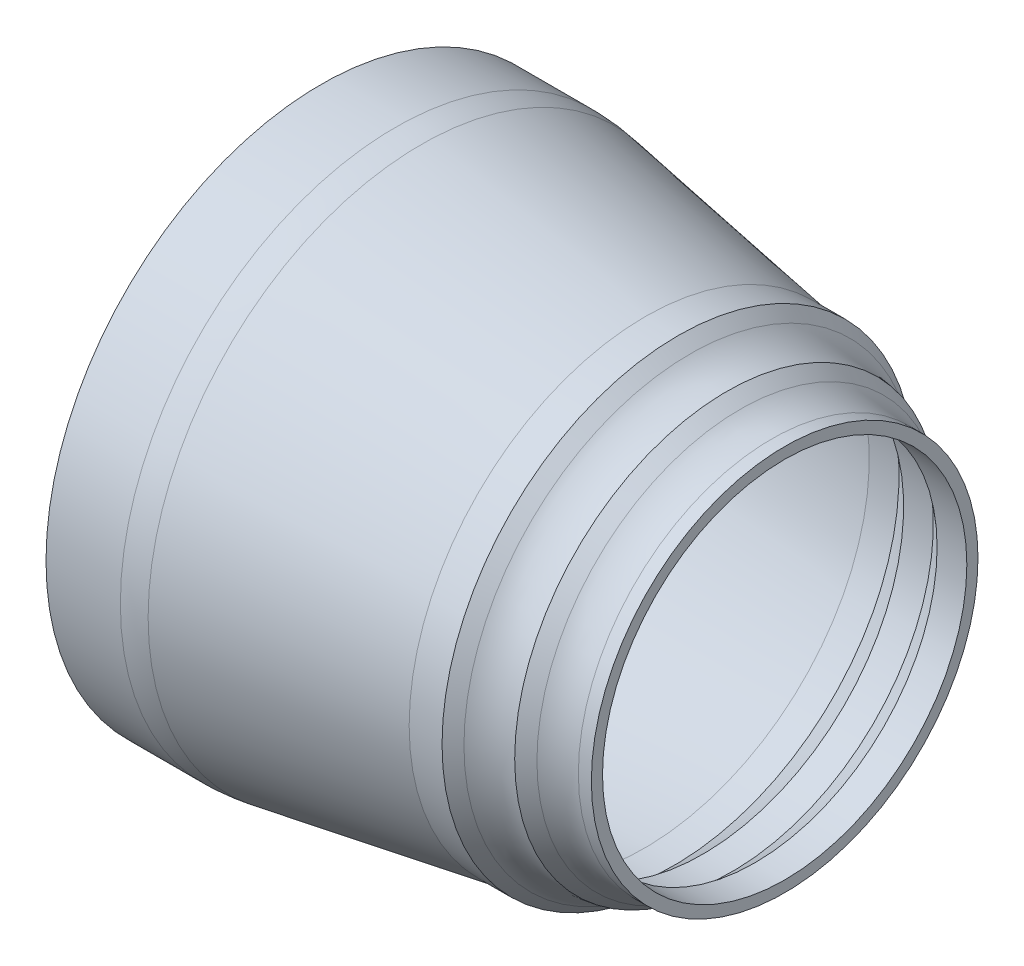
ISO-10303-21;
HEADER;
FILE_DESCRIPTION(('STEP AP214'),'2;1');
FILE_NAME('part.step','',(''),(''),'','','');
FILE_SCHEMA(('AUTOMOTIVE_DESIGN { 1 0 10303 214 1 1 1 1 }'));
ENDSEC;
DATA;
#1=APPLICATION_CONTEXT('core data for automotive mechanical design processes');
#2=APPLICATION_PROTOCOL_DEFINITION('international standard','automotive_design',2000,#1);
#3=PRODUCT_CONTEXT('',#1,'mechanical');
#4=PRODUCT('Part','Part','',(#3));
#5=PRODUCT_RELATED_PRODUCT_CATEGORY('part','',(#4));
#6=PRODUCT_DEFINITION_FORMATION('','',#4);
#7=PRODUCT_DEFINITION_CONTEXT('part definition',#1,'design');
#8=PRODUCT_DEFINITION('design','',#6,#7);
#9=PRODUCT_DEFINITION_SHAPE('','',#8);
#10=(LENGTH_UNIT() NAMED_UNIT(*) SI_UNIT(.MILLI.,.METRE.));
#11=(NAMED_UNIT(*) PLANE_ANGLE_UNIT() SI_UNIT($,.RADIAN.));
#12=(NAMED_UNIT(*) SI_UNIT($,.STERADIAN.) SOLID_ANGLE_UNIT());
#13=UNCERTAINTY_MEASURE_WITH_UNIT(LENGTH_MEASURE(1.E-05),#10,'distance_accuracy_value','');
#14=(GEOMETRIC_REPRESENTATION_CONTEXT(3) GLOBAL_UNCERTAINTY_ASSIGNED_CONTEXT((#13)) GLOBAL_UNIT_ASSIGNED_CONTEXT((#10,
#11,#12)) REPRESENTATION_CONTEXT('',''));
#15=CARTESIAN_POINT('',(0.,0.,0.));
#16=DIRECTION('',(0.,0.,1.));
#17=DIRECTION('',(1.,0.,0.));
#18=AXIS2_PLACEMENT_3D('',#15,#16,#17);
#19=CARTESIAN_POINT('',(-206.,0.,0.));
#20=DIRECTION('',(-1.,0.,0.));
#21=DIRECTION('',(0.,0.,1.));
#22=AXIS2_PLACEMENT_3D('',#19,#20,#21);
#23=CONICAL_SURFACE('',#22,98.,0.694738276196707);
#24=CARTESIAN_POINT('',(-218.,0.,0.));
#25=DIRECTION('',(-1.,0.,0.));
#26=DIRECTION('',(0.,0.,1.));
#27=AXIS2_PLACEMENT_3D('',#24,#25,#26);
#28=CIRCLE('',#27,108.);
#29=CARTESIAN_POINT('',(-218.,0.,108.));
#30=VERTEX_POINT('',#29);
#31=EDGE_CURVE('E120',#30,#30,#28,.T.);
#32=ORIENTED_EDGE('',*,*,#31,.T.);
#33=EDGE_LOOP('',(#32));
#34=FACE_BOUND('',#33,.T.);
#35=CARTESIAN_POINT('',(-206.,0.,0.));
#36=DIRECTION('',(-1.,0.,0.));
#37=DIRECTION('',(0.,0.,1.));
#38=AXIS2_PLACEMENT_3D('',#35,#36,#37);
#39=CIRCLE('',#38,98.);
#40=CARTESIAN_POINT('',(-206.,0.,98.));
#41=VERTEX_POINT('',#40);
#42=EDGE_CURVE('E10',#41,#41,#39,.T.);
#43=ORIENTED_EDGE('',*,*,#42,.F.);
#44=EDGE_LOOP('',(#43));
#45=FACE_BOUND('',#44,.T.);
#46=ADVANCED_FACE('F37',(#34,#45),#23,.F.);
#47=CARTESIAN_POINT('',(0.,0.,0.));
#48=DIRECTION('',(-1.,0.,0.));
#49=DIRECTION('',(0.,0.,1.));
#50=AXIS2_PLACEMENT_3D('',#47,#48,#49);
#51=CYLINDRICAL_SURFACE('',#50,98.);
#52=ORIENTED_EDGE('',*,*,#42,.T.);
#53=EDGE_LOOP('',(#52));
#54=FACE_BOUND('',#53,.T.);
#55=CARTESIAN_POINT('',(-190.,0.,0.));
#56=DIRECTION('',(-1.,0.,0.));
#57=DIRECTION('',(0.,0.,1.));
#58=AXIS2_PLACEMENT_3D('',#55,#56,#57);
#59=CIRCLE('',#58,98.);
#60=CARTESIAN_POINT('',(-190.,0.,98.));
#61=VERTEX_POINT('',#60);
#62=EDGE_CURVE('E44',#61,#61,#59,.T.);
#63=ORIENTED_EDGE('',*,*,#62,.F.);
#64=EDGE_LOOP('',(#63));
#65=FACE_BOUND('',#64,.T.);
#66=ADVANCED_FACE('F180',(#54,#65),#51,.F.);
#67=CARTESIAN_POINT('',(-190.,-98.,0.));
#68=DIRECTION('',(1.,0.,0.));
#69=DIRECTION('',(0.,0.,-1.));
#70=AXIS2_PLACEMENT_3D('',#67,#68,#69);
#71=PLANE('',#70);
#72=ORIENTED_EDGE('',*,*,#62,.T.);
#73=EDGE_LOOP('',(#72));
#74=FACE_BOUND('',#73,.T.);
#75=CARTESIAN_POINT('',(-190.,0.,0.));
#76=DIRECTION('',(-1.,0.,0.));
#77=DIRECTION('',(0.,0.,1.));
#78=AXIS2_PLACEMENT_3D('',#75,#76,#77);
#79=CIRCLE('',#78,104.);
#80=CARTESIAN_POINT('',(-190.,0.,104.));
#81=VERTEX_POINT('',#80);
#82=EDGE_CURVE('E49',#81,#81,#79,.T.);
#83=ORIENTED_EDGE('',*,*,#82,.F.);
#84=EDGE_LOOP('',(#83));
#85=FACE_BOUND('',#84,.T.);
#86=ADVANCED_FACE('F177',(#74,#85),#71,.T.);
#87=CARTESIAN_POINT('',(0.,0.,0.));
#88=DIRECTION('',(-1.,0.,0.));
#89=DIRECTION('',(0.,0.,1.));
#90=AXIS2_PLACEMENT_3D('',#87,#88,#89);
#91=CYLINDRICAL_SURFACE('',#90,104.);
#92=ORIENTED_EDGE('',*,*,#82,.T.);
#93=EDGE_LOOP('',(#92));
#94=FACE_BOUND('',#93,.T.);
#95=CARTESIAN_POINT('',(-197.,0.,0.));
#96=DIRECTION('',(-1.,0.,0.));
#97=DIRECTION('',(0.,0.,1.));
#98=AXIS2_PLACEMENT_3D('',#95,#96,#97);
#99=CIRCLE('',#98,104.);
#100=CARTESIAN_POINT('',(-197.,0.,104.));
#101=VERTEX_POINT('',#100);
#102=EDGE_CURVE('E54',#101,#101,#99,.T.);
#103=ORIENTED_EDGE('',*,*,#102,.F.);
#104=EDGE_LOOP('',(#103));
#105=FACE_BOUND('',#104,.T.);
#106=ADVANCED_FACE('F173',(#94,#105),#91,.T.);
#107=CARTESIAN_POINT('',(-197.,0.,0.));
#108=DIRECTION('',(-1.,0.,0.));
#109=DIRECTION('',(0.,0.,1.));
#110=AXIS2_PLACEMENT_3D('',#107,#108,#109);
#111=TOROIDAL_SURFACE('',#110,134.,30.);
#112=ORIENTED_EDGE('',*,*,#102,.T.);
#113=EDGE_LOOP('',(#112));
#114=FACE_BOUND('',#113,.T.);
#115=CARTESIAN_POINT('',(-214.,0.,0.));
#116=DIRECTION('',(-1.,0.,0.));
#117=DIRECTION('',(0.,0.,1.));
#118=AXIS2_PLACEMENT_3D('',#115,#116,#117);
#119=CIRCLE('',#118,109.281585811384);
#120=CARTESIAN_POINT('',(-214.,0.,109.281585811384));
#121=VERTEX_POINT('',#120);
#122=EDGE_CURVE('E60',#121,#121,#119,.T.);
#123=ORIENTED_EDGE('',*,*,#122,.F.);
#124=EDGE_LOOP('',(#123));
#125=FACE_BOUND('',#124,.T.);
#126=ADVANCED_FACE('F169',(#114,#125),#111,.F.);
#127=CARTESIAN_POINT('',(-221.085945400737,0.,0.));
#128=DIRECTION('',(-1.,0.,0.));
#129=DIRECTION('',(0.,0.,1.));
#130=AXIS2_PLACEMENT_3D('',#127,#128,#129);
#131=CONICAL_SURFACE('',#130,114.154919144717,0.60245463338499);
#132=ORIENTED_EDGE('',*,*,#122,.T.);
#133=EDGE_LOOP('',(#132));
#134=FACE_BOUND('',#133,.T.);
#135=CARTESIAN_POINT('',(-221.085945400737,0.,0.));
#136=DIRECTION('',(-1.,0.,0.));
#137=DIRECTION('',(0.,0.,1.));
#138=AXIS2_PLACEMENT_3D('',#135,#136,#137);
#139=CIRCLE('',#138,114.154919144717);
#140=CARTESIAN_POINT('',(-221.085945400737,0.,114.154919144717));
#141=VERTEX_POINT('',#140);
#142=EDGE_CURVE('E64',#141,#141,#139,.T.);
#143=ORIENTED_EDGE('',*,*,#142,.F.);
#144=EDGE_LOOP('',(#143));
#145=FACE_BOUND('',#144,.T.);
#146=ADVANCED_FACE('F165',(#134,#145),#131,.T.);
#147=CARTESIAN_POINT('',(-220.348638035192,0.,0.));
#148=DIRECTION('',(-1.,0.,0.));
#149=DIRECTION('',(0.,0.,1.));
#150=AXIS2_PLACEMENT_3D('',#147,#148,#149);
#151=TOROIDAL_SURFACE('',#150,146.146423920965,32.);
#152=ORIENTED_EDGE('',*,*,#142,.T.);
#153=EDGE_LOOP('',(#152));
#154=FACE_BOUND('',#153,.T.);
#155=CARTESIAN_POINT('',(-240.912230418439,0.,0.));
#156=DIRECTION('',(-1.,0.,0.));
#157=DIRECTION('',(0.,0.,1.));
#158=AXIS2_PLACEMENT_3D('',#155,#156,#157);
#159=CIRCLE('',#158,121.62829454094);
#160=CARTESIAN_POINT('',(-240.912230418439,0.,121.62829454094));
#161=VERTEX_POINT('',#160);
#162=EDGE_CURVE('E68',#161,#161,#159,.T.);
#163=ORIENTED_EDGE('',*,*,#162,.F.);
#164=EDGE_LOOP('',(#163));
#165=FACE_BOUND('',#164,.T.);
#166=ADVANCED_FACE('F161',(#154,#165),#151,.F.);
#167=CARTESIAN_POINT('',(-247.316956158087,0.,0.));
#168=DIRECTION('',(-1.,0.,0.));
#169=DIRECTION('',(0.,0.,1.));
#170=AXIS2_PLACEMENT_3D('',#167,#168,#169);
#171=CONICAL_SURFACE('',#170,127.,0.69790282259507);
#172=ORIENTED_EDGE('',*,*,#162,.T.);
#173=EDGE_LOOP('',(#172));
#174=FACE_BOUND('',#173,.T.);
#175=CARTESIAN_POINT('',(-247.316956158087,0.,0.));
#176=DIRECTION('',(-1.,0.,0.));
#177=DIRECTION('',(0.,0.,1.));
#178=AXIS2_PLACEMENT_3D('',#175,#176,#177);
#179=CIRCLE('',#178,127.);
#180=CARTESIAN_POINT('',(-247.316956158087,0.,127.));
#181=VERTEX_POINT('',#180);
#182=EDGE_CURVE('E72',#181,#181,#179,.T.);
#183=ORIENTED_EDGE('',*,*,#182,.F.);
#184=EDGE_LOOP('',(#183));
#185=FACE_BOUND('',#184,.T.);
#186=ADVANCED_FACE('F157',(#174,#185),#171,.T.);
#187=CARTESIAN_POINT('',(0.,0.,0.));
#188=DIRECTION('',(-1.,0.,0.));
#189=DIRECTION('',(0.,0.,1.));
#190=AXIS2_PLACEMENT_3D('',#187,#188,#189);
#191=CYLINDRICAL_SURFACE('',#190,127.);
#192=ORIENTED_EDGE('',*,*,#182,.T.);
#193=EDGE_LOOP('',(#192));
#194=FACE_BOUND('',#193,.T.);
#195=CARTESIAN_POINT('',(-265.007764466211,0.,0.));
#196=DIRECTION('',(-1.,0.,0.));
#197=DIRECTION('',(0.,0.,1.));
#198=AXIS2_PLACEMENT_3D('',#195,#196,#197);
#199=CIRCLE('',#198,127.);
#200=CARTESIAN_POINT('',(-265.007764466211,0.,127.));
#201=VERTEX_POINT('',#200);
#202=EDGE_CURVE('E76',#201,#201,#199,.T.);
#203=ORIENTED_EDGE('',*,*,#202,.F.);
#204=EDGE_LOOP('',(#203));
#205=FACE_BOUND('',#204,.T.);
#206=ADVANCED_FACE('F153',(#194,#205),#191,.T.);
#207=CARTESIAN_POINT('',(-385.522110558114,0.,0.));
#208=DIRECTION('',(-1.,0.,0.));
#209=DIRECTION('',(0.,0.,1.));
#210=AXIS2_PLACEMENT_3D('',#207,#208,#209);
#211=CONICAL_SURFACE('',#210,146.907802753893,0.163711883837069);
#212=ORIENTED_EDGE('',*,*,#202,.T.);
#213=EDGE_LOOP('',(#212));
#214=FACE_BOUND('',#213,.T.);
#215=CARTESIAN_POINT('',(-385.522110558114,0.,0.));
#216=DIRECTION('',(-1.,0.,0.));
#217=DIRECTION('',(0.,0.,1.));
#218=AXIS2_PLACEMENT_3D('',#215,#216,#217);
#219=CIRCLE('',#218,146.907802753893);
#220=CARTESIAN_POINT('',(-385.522110558114,0.,146.907802753893));
#221=VERTEX_POINT('',#220);
#222=EDGE_CURVE('E80',#221,#221,#219,.T.);
#223=ORIENTED_EDGE('',*,*,#222,.F.);
#224=EDGE_LOOP('',(#223));
#225=FACE_BOUND('',#224,.T.);
#226=ADVANCED_FACE('F149',(#214,#225),#211,.T.);
#227=CARTESIAN_POINT('',(-398.723618023574,0.,0.));
#228=DIRECTION('',(-1.,0.,0.));
#229=DIRECTION('',(0.,0.,1.));
#230=AXIS2_PLACEMENT_3D('',#227,#228,#229);
#231=DEGENERATE_TOROIDAL_SURFACE('',#230,66.9908445995727,81.,.T.);
#232=ORIENTED_EDGE('',*,*,#222,.T.);
#233=EDGE_LOOP('',(#232));
#234=FACE_BOUND('',#233,.T.);
#235=CARTESIAN_POINT('',(-399.374599409358,0.,0.));
#236=DIRECTION('',(-1.,0.,0.));
#237=DIRECTION('',(0.,0.,1.));
#238=AXIS2_PLACEMENT_3D('',#235,#236,#237);
#239=CIRCLE('',#238,147.988228651376);
#240=CARTESIAN_POINT('',(-399.374599409358,0.,147.988228651376));
#241=VERTEX_POINT('',#240);
#242=EDGE_CURVE('E84',#241,#241,#239,.T.);
#243=ORIENTED_EDGE('',*,*,#242,.F.);
#244=EDGE_LOOP('',(#243));
#245=FACE_BOUND('',#244,.T.);
#246=ADVANCED_FACE('F145',(#234,#245),#231,.T.);
#247=CARTESIAN_POINT('',(0.,0.,0.));
#248=DIRECTION('',(-1.,0.,0.));
#249=DIRECTION('',(0.,0.,1.));
#250=AXIS2_PLACEMENT_3D('',#247,#248,#249);
#251=CYLINDRICAL_SURFACE('',#250,147.988228651376);
#252=ORIENTED_EDGE('',*,*,#242,.T.);
#253=EDGE_LOOP('',(#252));
#254=FACE_BOUND('',#253,.T.);
#255=CARTESIAN_POINT('',(-439.374599409358,0.,0.));
#256=DIRECTION('',(-1.,0.,0.));
#257=DIRECTION('',(0.,0.,1.));
#258=AXIS2_PLACEMENT_3D('',#255,#256,#257);
#259=CIRCLE('',#258,147.988228651376);
#260=CARTESIAN_POINT('',(-439.374599409358,0.,147.988228651376));
#261=VERTEX_POINT('',#260);
#262=EDGE_CURVE('E88',#261,#261,#259,.T.);
#263=ORIENTED_EDGE('',*,*,#262,.F.);
#264=EDGE_LOOP('',(#263));
#265=FACE_BOUND('',#264,.T.);
#266=ADVANCED_FACE('F141',(#254,#265),#251,.T.);
#267=CARTESIAN_POINT('',(-438.509351825108,0.,0.));
#268=DIRECTION('',(-1.,0.,0.));
#269=DIRECTION('',(0.,0.,1.));
#270=AXIS2_PLACEMENT_3D('',#267,#268,#269);
#271=CONICAL_SURFACE('',#270,145.32527040575,1.25663706143593);
#272=ORIENTED_EDGE('',*,*,#262,.T.);
#273=EDGE_LOOP('',(#272));
#274=FACE_BOUND('',#273,.T.);
#275=CARTESIAN_POINT('',(-438.509351825108,0.,0.));
#276=DIRECTION('',(-1.,0.,0.));
#277=DIRECTION('',(0.,0.,1.));
#278=AXIS2_PLACEMENT_3D('',#275,#276,#277);
#279=CIRCLE('',#278,145.32527040575);
#280=CARTESIAN_POINT('',(-438.509351825108,0.,145.32527040575));
#281=VERTEX_POINT('',#280);
#282=EDGE_CURVE('E92',#281,#281,#279,.T.);
#283=ORIENTED_EDGE('',*,*,#282,.F.);
#284=EDGE_LOOP('',(#283));
#285=FACE_BOUND('',#284,.T.);
#286=ADVANCED_FACE('F136',(#274,#285),#271,.F.);
#287=CARTESIAN_POINT('',(-432.826378565967,-141.988422425317,0.));
#288=CARTESIAN_POINT('',(-433.583616451594,-141.988422425317,0.));
#289=CARTESIAN_POINT('',(-435.743719609604,-142.389326154313,0.));
#290=CARTESIAN_POINT('',(-438.092908158658,-144.043588589353,0.));
#291=CARTESIAN_POINT('',(-438.509351825108,-145.32527040575,0.));
#292=B_SPLINE_CURVE_WITH_KNOTS('',3,(#287,#288,#289,#290,#291),.UNSPECIFIED.,.F.,.F.,(4,1,4),
(0.,0.329213164463666,1.),.UNSPECIFIED.);
#293=CARTESIAN_POINT('',(0.,0.,0.));
#294=DIRECTION('',(-1.,0.,0.));
#295=AXIS1_PLACEMENT('',#293,#294);
#296=SURFACE_OF_REVOLUTION('',#292,#295);
#297=ORIENTED_EDGE('',*,*,#282,.T.);
#298=EDGE_LOOP('',(#297));
#299=FACE_BOUND('',#298,.T.);
#300=CARTESIAN_POINT('',(-432.826378565967,0.,0.));
#301=DIRECTION('',(-1.,0.,0.));
#302=DIRECTION('',(0.,0.,1.));
#303=AXIS2_PLACEMENT_3D('',#300,#301,#302);
#304=CIRCLE('',#303,141.988422425317);
#305=CARTESIAN_POINT('',(-432.826378565967,0.,141.988422425317));
#306=VERTEX_POINT('',#305);
#307=EDGE_CURVE('E96',#306,#306,#304,.T.);
#308=ORIENTED_EDGE('',*,*,#307,.F.);
#309=EDGE_LOOP('',(#308));
#310=FACE_BOUND('',#309,.T.);
#311=ADVANCED_FACE('F131',(#299,#310),#296,.F.);
#312=CARTESIAN_POINT('',(0.,0.,0.));
#313=DIRECTION('',(-1.,0.,0.));
#314=DIRECTION('',(0.,0.,1.));
#315=AXIS2_PLACEMENT_3D('',#312,#313,#314);
#316=CYLINDRICAL_SURFACE('',#315,141.988422425317);
#317=ORIENTED_EDGE('',*,*,#307,.T.);
#318=EDGE_LOOP('',(#317));
#319=FACE_BOUND('',#318,.T.);
#320=CARTESIAN_POINT('',(-399.326378565967,0.,0.));
#321=DIRECTION('',(-1.,0.,0.));
#322=DIRECTION('',(0.,0.,1.));
#323=AXIS2_PLACEMENT_3D('',#320,#321,#322);
#324=CIRCLE('',#323,141.988422425317);
#325=CARTESIAN_POINT('',(-399.326378565967,0.,141.988422425317));
#326=VERTEX_POINT('',#325);
#327=EDGE_CURVE('E100',#326,#326,#324,.T.);
#328=ORIENTED_EDGE('',*,*,#327,.F.);
#329=EDGE_LOOP('',(#328));
#330=FACE_BOUND('',#329,.T.);
#331=ADVANCED_FACE('F135',(#319,#330),#316,.F.);
#332=CARTESIAN_POINT('',(-398.723618023574,0.,0.));
#333=DIRECTION('',(-1.,0.,0.));
#334=DIRECTION('',(0.,0.,1.));
#335=AXIS2_PLACEMENT_3D('',#332,#333,#334);
#336=DEGENERATE_TOROIDAL_SURFACE('',#335,66.9908445995727,75.0000000000001,.T.);
#337=ORIENTED_EDGE('',*,*,#327,.T.);
#338=EDGE_LOOP('',(#337));
#339=FACE_BOUND('',#338,.T.);
#340=CARTESIAN_POINT('',(-386.5,0.,0.));
#341=DIRECTION('',(-1.,0.,0.));
#342=DIRECTION('',(0.,0.,1.));
#343=AXIS2_PLACEMENT_3D('',#340,#341,#342);
#344=CIRCLE('',#343,140.988028075795);
#345=CARTESIAN_POINT('',(-386.5,0.,140.988028075795));
#346=VERTEX_POINT('',#345);
#347=EDGE_CURVE('E104',#346,#346,#344,.T.);
#348=ORIENTED_EDGE('',*,*,#347,.F.);
#349=EDGE_LOOP('',(#348));
#350=FACE_BOUND('',#349,.T.);
#351=ADVANCED_FACE('F209',(#339,#350),#336,.F.);
#352=CARTESIAN_POINT('',(-265.5,0.,0.));
#353=DIRECTION('',(-1.,0.,0.));
#354=DIRECTION('',(0.,0.,1.));
#355=AXIS2_PLACEMENT_3D('',#352,#353,#354);
#356=CONICAL_SURFACE('',#355,121.,0.163711883837069);
#357=ORIENTED_EDGE('',*,*,#347,.T.);
#358=EDGE_LOOP('',(#357));
#359=FACE_BOUND('',#358,.T.);
#360=CARTESIAN_POINT('',(-265.5,0.,0.));
#361=DIRECTION('',(-1.,0.,0.));
#362=DIRECTION('',(0.,0.,1.));
#363=AXIS2_PLACEMENT_3D('',#360,#361,#362);
#364=CIRCLE('',#363,121.);
#365=CARTESIAN_POINT('',(-265.5,0.,121.));
#366=VERTEX_POINT('',#365);
#367=EDGE_CURVE('E108',#366,#366,#364,.T.);
#368=ORIENTED_EDGE('',*,*,#367,.F.);
#369=EDGE_LOOP('',(#368));
#370=FACE_BOUND('',#369,.T.);
#371=ADVANCED_FACE('F206',(#359,#370),#356,.F.);
#372=CARTESIAN_POINT('',(0.,0.,0.));
#373=DIRECTION('',(-1.,0.,0.));
#374=DIRECTION('',(0.,0.,1.));
#375=AXIS2_PLACEMENT_3D('',#372,#373,#374);
#376=CYLINDRICAL_SURFACE('',#375,121.);
#377=ORIENTED_EDGE('',*,*,#367,.T.);
#378=EDGE_LOOP('',(#377));
#379=FACE_BOUND('',#378,.T.);
#380=CARTESIAN_POINT('',(-249.5,0.,0.));
#381=DIRECTION('',(-1.,0.,0.));
#382=DIRECTION('',(0.,0.,1.));
#383=AXIS2_PLACEMENT_3D('',#380,#381,#382);
#384=CIRCLE('',#383,121.);
#385=CARTESIAN_POINT('',(-249.5,0.,121.));
#386=VERTEX_POINT('',#385);
#387=EDGE_CURVE('E112',#386,#386,#384,.T.);
#388=ORIENTED_EDGE('',*,*,#387,.F.);
#389=EDGE_LOOP('',(#388));
#390=FACE_BOUND('',#389,.T.);
#391=ADVANCED_FACE('F200',(#379,#390),#376,.F.);
#392=CARTESIAN_POINT('',(-234.,0.,0.));
#393=DIRECTION('',(-1.,0.,0.));
#394=DIRECTION('',(0.,0.,1.));
#395=AXIS2_PLACEMENT_3D('',#392,#393,#394);
#396=CONICAL_SURFACE('',#395,108.,0.697902822595056);
#397=ORIENTED_EDGE('',*,*,#387,.T.);
#398=EDGE_LOOP('',(#397));
#399=FACE_BOUND('',#398,.T.);
#400=CARTESIAN_POINT('',(-234.,0.,0.));
#401=DIRECTION('',(-1.,0.,0.));
#402=DIRECTION('',(0.,0.,1.));
#403=AXIS2_PLACEMENT_3D('',#400,#401,#402);
#404=CIRCLE('',#403,108.);
#405=CARTESIAN_POINT('',(-234.,0.,108.));
#406=VERTEX_POINT('',#405);
#407=EDGE_CURVE('E116',#406,#406,#404,.T.);
#408=ORIENTED_EDGE('',*,*,#407,.F.);
#409=EDGE_LOOP('',(#408));
#410=FACE_BOUND('',#409,.T.);
#411=ADVANCED_FACE('F194',(#399,#410),#396,.F.);
#412=CARTESIAN_POINT('',(0.,0.,0.));
#413=DIRECTION('',(-1.,0.,0.));
#414=DIRECTION('',(0.,0.,1.));
#415=AXIS2_PLACEMENT_3D('',#412,#413,#414);
#416=CYLINDRICAL_SURFACE('',#415,108.);
#417=ORIENTED_EDGE('',*,*,#407,.T.);
#418=EDGE_LOOP('',(#417));
#419=FACE_BOUND('',#418,.T.);
#420=ORIENTED_EDGE('',*,*,#31,.F.);
#421=EDGE_LOOP('',(#420));
#422=FACE_BOUND('',#421,.T.);
#423=ADVANCED_FACE('F192',(#419,#422),#416,.F.);
#424=CLOSED_SHELL('',(#46,#66,#86,#106,#126,#146,#166,#186,#206,#226,#246,#266,#286,#311,#331,
#351,#371,#391,#411,#423));
#425=MANIFOLD_SOLID_BREP('B2',#424);
#426=ADVANCED_BREP_SHAPE_REPRESENTATION('',(#18,#425),#14);
#427=SHAPE_DEFINITION_REPRESENTATION(#9,#426);
ENDSEC;
END-ISO-10303-21;
